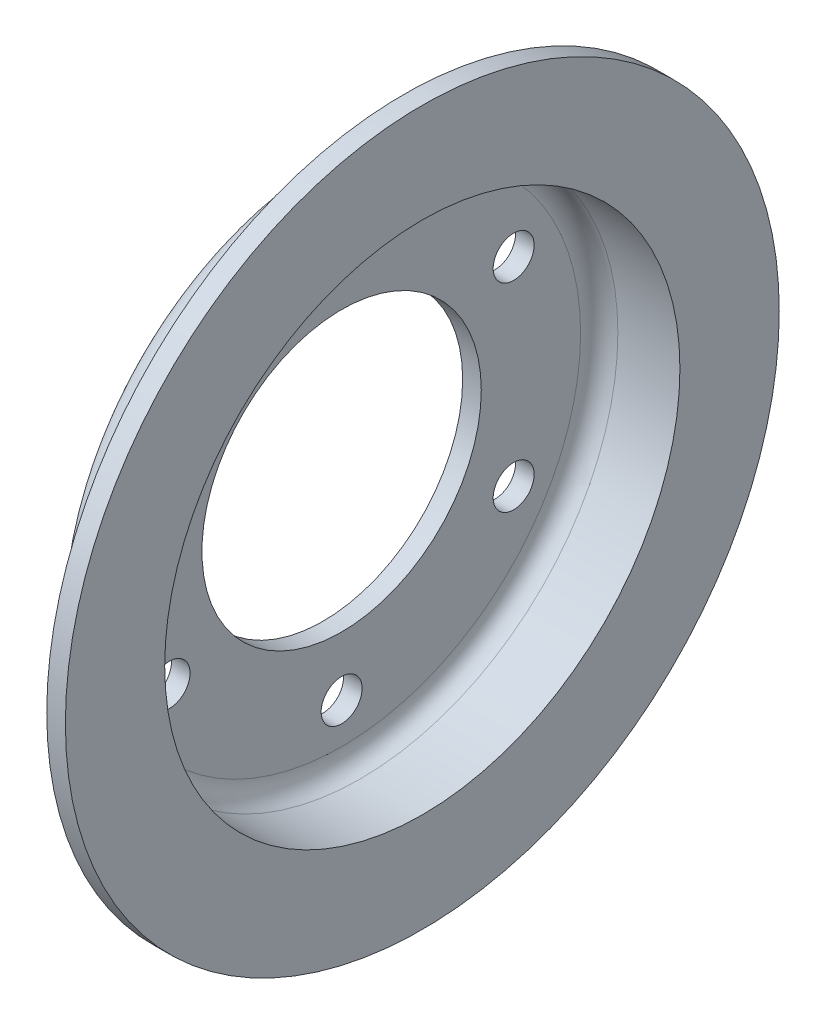
ISO-10303-21;
HEADER;
FILE_DESCRIPTION(('STEP AP214'),'2;1');
FILE_NAME('part.step','',(''),(''),'','','');
FILE_SCHEMA(('AUTOMOTIVE_DESIGN { 1 0 10303 214 1 1 1 1 }'));
ENDSEC;
DATA;
#1=APPLICATION_CONTEXT('core data for automotive mechanical design processes');
#2=APPLICATION_PROTOCOL_DEFINITION('international standard','automotive_design',2000,#1);
#3=PRODUCT_CONTEXT('',#1,'mechanical');
#4=PRODUCT('Part','Part','',(#3));
#5=PRODUCT_RELATED_PRODUCT_CATEGORY('part','',(#4));
#6=PRODUCT_DEFINITION_FORMATION('','',#4);
#7=PRODUCT_DEFINITION_CONTEXT('part definition',#1,'design');
#8=PRODUCT_DEFINITION('design','',#6,#7);
#9=PRODUCT_DEFINITION_SHAPE('','',#8);
#10=(LENGTH_UNIT() NAMED_UNIT(*) SI_UNIT(.MILLI.,.METRE.));
#11=(NAMED_UNIT(*) PLANE_ANGLE_UNIT() SI_UNIT($,.RADIAN.));
#12=(NAMED_UNIT(*) SI_UNIT($,.STERADIAN.) SOLID_ANGLE_UNIT());
#13=UNCERTAINTY_MEASURE_WITH_UNIT(LENGTH_MEASURE(1.E-05),#10,'distance_accuracy_value','');
#14=(GEOMETRIC_REPRESENTATION_CONTEXT(3) GLOBAL_UNCERTAINTY_ASSIGNED_CONTEXT((#13)) GLOBAL_UNIT_ASSIGNED_CONTEXT((#10,
#11,#12)) REPRESENTATION_CONTEXT('',''));
#15=CARTESIAN_POINT('',(0.,0.,0.));
#16=DIRECTION('',(0.,0.,1.));
#17=DIRECTION('',(1.,0.,0.));
#18=AXIS2_PLACEMENT_3D('',#15,#16,#17);
#19=CARTESIAN_POINT('',(13.,0.,0.));
#20=DIRECTION('',(-1.,0.,0.));
#21=DIRECTION('',(0.,0.,1.));
#22=AXIS2_PLACEMENT_3D('',#19,#20,#21);
#23=CYLINDRICAL_SURFACE('',#22,41.5);
#24=CARTESIAN_POINT('',(6.,0.,0.));
#25=DIRECTION('',(1.,0.,0.));
#26=DIRECTION('',(0.,0.,-1.));
#27=AXIS2_PLACEMENT_3D('',#24,#25,#26);
#28=CIRCLE('',#27,41.5);
#29=CARTESIAN_POINT('',(6.,0.,-41.5));
#30=VERTEX_POINT('',#29);
#31=EDGE_CURVE('E61',#30,#30,#28,.F.);
#32=ORIENTED_EDGE('',*,*,#31,.T.);
#33=EDGE_LOOP('',(#32));
#34=FACE_BOUND('',#33,.T.);
#35=CARTESIAN_POINT('',(16.,0.,0.));
#36=DIRECTION('',(1.,0.,0.));
#37=DIRECTION('',(0.,0.,-1.));
#38=AXIS2_PLACEMENT_3D('',#35,#36,#37);
#39=CIRCLE('',#38,41.5);
#40=CARTESIAN_POINT('',(16.,0.,-41.5));
#41=VERTEX_POINT('',#40);
#42=EDGE_CURVE('E76',#41,#41,#39,.T.);
#43=ORIENTED_EDGE('',*,*,#42,.T.);
#44=EDGE_LOOP('',(#43));
#45=FACE_BOUND('',#44,.T.);
#46=ADVANCED_FACE('F43',(#34,#45),#23,.F.);
#47=CARTESIAN_POINT('',(3.,0.,0.));
#48=DIRECTION('',(1.,0.,0.));
#49=DIRECTION('',(0.,0.,-1.));
#50=AXIS2_PLACEMENT_3D('',#47,#48,#49);
#51=PLANE('',#50);
#52=CARTESIAN_POINT('',(3.,16.0000000000003,-27.7128129211019));
#53=DIRECTION('',(1.,0.,0.));
#54=DIRECTION('',(0.,0.,-1.));
#55=AXIS2_PLACEMENT_3D('',#52,#53,#54);
#56=CIRCLE('',#55,3.29999999999999);
#57=CARTESIAN_POINT('',(3.,16.0000000000003,-31.0128129211018));
#58=VERTEX_POINT('',#57);
#59=EDGE_CURVE('E135',#58,#58,#56,.T.);
#60=ORIENTED_EDGE('',*,*,#59,.F.);
#61=EDGE_LOOP('',(#60));
#62=FACE_BOUND('',#61,.T.);
#63=CARTESIAN_POINT('',(3.,-15.9999999999997,-27.7128129211022));
#64=DIRECTION('',(1.,0.,0.));
#65=DIRECTION('',(0.,0.,-1.));
#66=AXIS2_PLACEMENT_3D('',#63,#64,#65);
#67=CIRCLE('',#66,3.29999999999999);
#68=CARTESIAN_POINT('',(3.,-15.9999999999997,-31.0128129211022));
#69=VERTEX_POINT('',#68);
#70=EDGE_CURVE('E127',#69,#69,#67,.T.);
#71=ORIENTED_EDGE('',*,*,#70,.F.);
#72=EDGE_LOOP('',(#71));
#73=FACE_BOUND('',#72,.T.);
#74=CARTESIAN_POINT('',(3.,-32.,0.));
#75=DIRECTION('',(1.,0.,0.));
#76=DIRECTION('',(0.,0.,-1.));
#77=AXIS2_PLACEMENT_3D('',#74,#75,#76);
#78=CIRCLE('',#77,3.29999999999999);
#79=CARTESIAN_POINT('',(3.,-32.,-3.29999999999999));
#80=VERTEX_POINT('',#79);
#81=EDGE_CURVE('E119',#80,#80,#78,.T.);
#82=ORIENTED_EDGE('',*,*,#81,.F.);
#83=EDGE_LOOP('',(#82));
#84=FACE_BOUND('',#83,.T.);
#85=CARTESIAN_POINT('',(3.,-16.0000000000001,27.712812921102));
#86=DIRECTION('',(1.,0.,0.));
#87=DIRECTION('',(0.,0.,-1.));
#88=AXIS2_PLACEMENT_3D('',#85,#86,#87);
#89=CIRCLE('',#88,3.29999999999999);
#90=CARTESIAN_POINT('',(3.,-16.0000000000001,24.412812921102));
#91=VERTEX_POINT('',#90);
#92=EDGE_CURVE('E111',#91,#91,#89,.T.);
#93=ORIENTED_EDGE('',*,*,#92,.F.);
#94=EDGE_LOOP('',(#93));
#95=FACE_BOUND('',#94,.T.);
#96=CARTESIAN_POINT('',(3.,15.9999999999999,27.7128129211021));
#97=DIRECTION('',(1.,0.,0.));
#98=DIRECTION('',(0.,0.,-1.));
#99=AXIS2_PLACEMENT_3D('',#96,#97,#98);
#100=CIRCLE('',#99,3.29999999999999);
#101=CARTESIAN_POINT('',(3.,15.9999999999999,24.4128129211021));
#102=VERTEX_POINT('',#101);
#103=EDGE_CURVE('E103',#102,#102,#100,.T.);
#104=ORIENTED_EDGE('',*,*,#103,.F.);
#105=EDGE_LOOP('',(#104));
#106=FACE_BOUND('',#105,.T.);
#107=CARTESIAN_POINT('',(3.,32.,0.));
#108=DIRECTION('',(1.,0.,0.));
#109=DIRECTION('',(0.,0.,-1.));
#110=AXIS2_PLACEMENT_3D('',#107,#108,#109);
#111=CIRCLE('',#110,3.29999999999998);
#112=CARTESIAN_POINT('',(3.,32.,-3.29999999999998));
#113=VERTEX_POINT('',#112);
#114=EDGE_CURVE('E95',#113,#113,#111,.T.);
#115=ORIENTED_EDGE('',*,*,#114,.F.);
#116=EDGE_LOOP('',(#115));
#117=FACE_BOUND('',#116,.T.);
#118=CARTESIAN_POINT('',(3.,0.,0.));
#119=DIRECTION('',(1.,0.,0.));
#120=DIRECTION('',(0.,0.,-1.));
#121=AXIS2_PLACEMENT_3D('',#118,#119,#120);
#122=CIRCLE('',#121,38.5);
#123=CARTESIAN_POINT('',(3.,0.,-38.5));
#124=VERTEX_POINT('',#123);
#125=EDGE_CURVE('E56',#124,#124,#122,.T.);
#126=ORIENTED_EDGE('',*,*,#125,.T.);
#127=EDGE_LOOP('',(#126));
#128=FACE_BOUND('',#127,.T.);
#129=CARTESIAN_POINT('',(3.,0.,0.));
#130=DIRECTION('',(1.,0.,0.));
#131=DIRECTION('',(0.,0.,-1.));
#132=AXIS2_PLACEMENT_3D('',#129,#130,#131);
#133=CIRCLE('',#132,22.5);
#134=CARTESIAN_POINT('',(3.,0.,-22.5));
#135=VERTEX_POINT('',#134);
#136=EDGE_CURVE('E84',#135,#135,#133,.T.);
#137=ORIENTED_EDGE('',*,*,#136,.F.);
#138=EDGE_LOOP('',(#137));
#139=FACE_BOUND('',#138,.T.);
#140=ADVANCED_FACE('F142',(#62,#73,#84,#95,#106,#117,#128,#139),#51,.T.);
#141=CARTESIAN_POINT('',(16.,0.,0.));
#142=DIRECTION('',(1.,0.,0.));
#143=DIRECTION('',(0.,0.,-1.));
#144=AXIS2_PLACEMENT_3D('',#141,#142,#143);
#145=PLANE('',#144);
#146=CARTESIAN_POINT('',(16.,0.,0.));
#147=DIRECTION('',(1.,0.,0.));
#148=DIRECTION('',(0.,0.,-1.));
#149=AXIS2_PLACEMENT_3D('',#146,#147,#148);
#150=CIRCLE('',#149,57.5);
#151=CARTESIAN_POINT('',(16.,0.,-57.5));
#152=VERTEX_POINT('',#151);
#153=EDGE_CURVE('E71',#152,#152,#150,.T.);
#154=ORIENTED_EDGE('',*,*,#153,.T.);
#155=EDGE_LOOP('',(#154));
#156=FACE_BOUND('',#155,.T.);
#157=ORIENTED_EDGE('',*,*,#42,.F.);
#158=EDGE_LOOP('',(#157));
#159=FACE_BOUND('',#158,.T.);
#160=ADVANCED_FACE('F145',(#156,#159),#145,.T.);
#161=CARTESIAN_POINT('',(13.,0.,0.));
#162=DIRECTION('',(1.,0.,0.));
#163=DIRECTION('',(0.,0.,-1.));
#164=AXIS2_PLACEMENT_3D('',#161,#162,#163);
#165=PLANE('',#164);
#166=CARTESIAN_POINT('',(13.,0.,0.));
#167=DIRECTION('',(1.,0.,0.));
#168=DIRECTION('',(0.,0.,-1.));
#169=AXIS2_PLACEMENT_3D('',#166,#167,#168);
#170=CIRCLE('',#169,44.5);
#171=CARTESIAN_POINT('',(13.,0.,-44.5));
#172=VERTEX_POINT('',#171);
#173=EDGE_CURVE('E67',#172,#172,#170,.T.);
#174=ORIENTED_EDGE('',*,*,#173,.T.);
#175=EDGE_LOOP('',(#174));
#176=FACE_BOUND('',#175,.T.);
#177=CARTESIAN_POINT('',(13.,0.,0.));
#178=DIRECTION('',(1.,0.,0.));
#179=DIRECTION('',(0.,0.,-1.));
#180=AXIS2_PLACEMENT_3D('',#177,#178,#179);
#181=CIRCLE('',#180,57.5);
#182=CARTESIAN_POINT('',(13.,0.,-57.5));
#183=VERTEX_POINT('',#182);
#184=EDGE_CURVE('E72',#183,#183,#181,.T.);
#185=ORIENTED_EDGE('',*,*,#184,.F.);
#186=EDGE_LOOP('',(#185));
#187=FACE_BOUND('',#186,.T.);
#188=ADVANCED_FACE('F192',(#176,#187),#165,.F.);
#189=CARTESIAN_POINT('',(16.,0.,0.));
#190=DIRECTION('',(-1.,0.,0.));
#191=DIRECTION('',(0.,0.,1.));
#192=AXIS2_PLACEMENT_3D('',#189,#190,#191);
#193=CYLINDRICAL_SURFACE('',#192,57.5);
#194=ORIENTED_EDGE('',*,*,#153,.F.);
#195=EDGE_LOOP('',(#194));
#196=FACE_BOUND('',#195,.T.);
#197=ORIENTED_EDGE('',*,*,#184,.T.);
#198=EDGE_LOOP('',(#197));
#199=FACE_BOUND('',#198,.T.);
#200=ADVANCED_FACE('F184',(#196,#199),#193,.T.);
#201=CARTESIAN_POINT('',(0.,0.,0.));
#202=DIRECTION('',(1.,0.,0.));
#203=DIRECTION('',(0.,0.,-1.));
#204=AXIS2_PLACEMENT_3D('',#201,#202,#203);
#205=PLANE('',#204);
#206=CARTESIAN_POINT('',(0.,16.0000000000003,-27.7128129211019));
#207=DIRECTION('',(1.,0.,0.));
#208=DIRECTION('',(0.,0.,-1.));
#209=AXIS2_PLACEMENT_3D('',#206,#207,#208);
#210=CIRCLE('',#209,3.3);
#211=CARTESIAN_POINT('',(0.,16.0000000000003,-31.0128129211018));
#212=VERTEX_POINT('',#211);
#213=EDGE_CURVE('E131',#212,#212,#210,.T.);
#214=ORIENTED_EDGE('',*,*,#213,.T.);
#215=EDGE_LOOP('',(#214));
#216=FACE_BOUND('',#215,.T.);
#217=CARTESIAN_POINT('',(0.,-15.9999999999997,-27.7128129211022));
#218=DIRECTION('',(1.,0.,0.));
#219=DIRECTION('',(0.,0.,-1.));
#220=AXIS2_PLACEMENT_3D('',#217,#218,#219);
#221=CIRCLE('',#220,3.3);
#222=CARTESIAN_POINT('',(0.,-15.9999999999997,-31.0128129211022));
#223=VERTEX_POINT('',#222);
#224=EDGE_CURVE('E123',#223,#223,#221,.T.);
#225=ORIENTED_EDGE('',*,*,#224,.T.);
#226=EDGE_LOOP('',(#225));
#227=FACE_BOUND('',#226,.T.);
#228=CARTESIAN_POINT('',(0.,-32.,0.));
#229=DIRECTION('',(1.,0.,0.));
#230=DIRECTION('',(0.,0.,-1.));
#231=AXIS2_PLACEMENT_3D('',#228,#229,#230);
#232=CIRCLE('',#231,3.3);
#233=CARTESIAN_POINT('',(0.,-32.,-3.3));
#234=VERTEX_POINT('',#233);
#235=EDGE_CURVE('E115',#234,#234,#232,.T.);
#236=ORIENTED_EDGE('',*,*,#235,.T.);
#237=EDGE_LOOP('',(#236));
#238=FACE_BOUND('',#237,.T.);
#239=CARTESIAN_POINT('',(0.,-16.0000000000001,27.712812921102));
#240=DIRECTION('',(1.,0.,0.));
#241=DIRECTION('',(0.,0.,-1.));
#242=AXIS2_PLACEMENT_3D('',#239,#240,#241);
#243=CIRCLE('',#242,3.3);
#244=CARTESIAN_POINT('',(0.,-16.0000000000001,24.412812921102));
#245=VERTEX_POINT('',#244);
#246=EDGE_CURVE('E107',#245,#245,#243,.T.);
#247=ORIENTED_EDGE('',*,*,#246,.T.);
#248=EDGE_LOOP('',(#247));
#249=FACE_BOUND('',#248,.T.);
#250=CARTESIAN_POINT('',(0.,15.9999999999999,27.7128129211021));
#251=DIRECTION('',(1.,0.,0.));
#252=DIRECTION('',(0.,0.,-1.));
#253=AXIS2_PLACEMENT_3D('',#250,#251,#252);
#254=CIRCLE('',#253,3.3);
#255=CARTESIAN_POINT('',(0.,15.9999999999999,24.4128129211021));
#256=VERTEX_POINT('',#255);
#257=EDGE_CURVE('E99',#256,#256,#254,.T.);
#258=ORIENTED_EDGE('',*,*,#257,.T.);
#259=EDGE_LOOP('',(#258));
#260=FACE_BOUND('',#259,.T.);
#261=CARTESIAN_POINT('',(0.,32.,0.));
#262=DIRECTION('',(1.,0.,0.));
#263=DIRECTION('',(0.,0.,-1.));
#264=AXIS2_PLACEMENT_3D('',#261,#262,#263);
#265=CIRCLE('',#264,3.3);
#266=CARTESIAN_POINT('',(0.,32.,-3.3));
#267=VERTEX_POINT('',#266);
#268=EDGE_CURVE('E88',#267,#267,#265,.T.);
#269=ORIENTED_EDGE('',*,*,#268,.T.);
#270=EDGE_LOOP('',(#269));
#271=FACE_BOUND('',#270,.T.);
#272=CARTESIAN_POINT('',(0.,0.,0.));
#273=DIRECTION('',(1.,0.,0.));
#274=DIRECTION('',(0.,0.,-1.));
#275=AXIS2_PLACEMENT_3D('',#272,#273,#274);
#276=CIRCLE('',#275,39.5);
#277=CARTESIAN_POINT('',(0.,0.,-39.5));
#278=VERTEX_POINT('',#277);
#279=EDGE_CURVE('E10',#278,#278,#276,.F.);
#280=ORIENTED_EDGE('',*,*,#279,.T.);
#281=EDGE_LOOP('',(#280));
#282=FACE_BOUND('',#281,.T.);
#283=CARTESIAN_POINT('',(0.,0.,0.));
#284=DIRECTION('',(1.,0.,0.));
#285=DIRECTION('',(0.,0.,-1.));
#286=AXIS2_PLACEMENT_3D('',#283,#284,#285);
#287=CIRCLE('',#286,22.5);
#288=CARTESIAN_POINT('',(0.,0.,-22.5));
#289=VERTEX_POINT('',#288);
#290=EDGE_CURVE('E83',#289,#289,#287,.T.);
#291=ORIENTED_EDGE('',*,*,#290,.T.);
#292=EDGE_LOOP('',(#291));
#293=FACE_BOUND('',#292,.T.);
#294=ADVANCED_FACE('F172',(#216,#227,#238,#249,#260,#271,#282,#293),#205,.F.);
#295=CARTESIAN_POINT('',(3.,0.,0.));
#296=DIRECTION('',(-1.,0.,0.));
#297=DIRECTION('',(0.,0.,1.));
#298=AXIS2_PLACEMENT_3D('',#295,#296,#297);
#299=CYLINDRICAL_SURFACE('',#298,44.5);
#300=CARTESIAN_POINT('',(5.,0.,0.));
#301=DIRECTION('',(1.,0.,0.));
#302=DIRECTION('',(0.,0.,-1.));
#303=AXIS2_PLACEMENT_3D('',#300,#301,#302);
#304=CIRCLE('',#303,44.5);
#305=CARTESIAN_POINT('',(5.,0.,-44.5));
#306=VERTEX_POINT('',#305);
#307=EDGE_CURVE('E51',#306,#306,#304,.T.);
#308=ORIENTED_EDGE('',*,*,#307,.T.);
#309=EDGE_LOOP('',(#308));
#310=FACE_BOUND('',#309,.T.);
#311=ORIENTED_EDGE('',*,*,#173,.F.);
#312=EDGE_LOOP('',(#311));
#313=FACE_BOUND('',#312,.T.);
#314=ADVANCED_FACE('F164',(#310,#313),#299,.T.);
#315=CARTESIAN_POINT('',(0.,0.,0.));
#316=DIRECTION('',(1.,0.,0.));
#317=DIRECTION('',(0.,0.,-1.));
#318=AXIS2_PLACEMENT_3D('',#315,#316,#317);
#319=CYLINDRICAL_SURFACE('',#318,22.5);
#320=ORIENTED_EDGE('',*,*,#290,.F.);
#321=EDGE_LOOP('',(#320));
#322=FACE_BOUND('',#321,.T.);
#323=ORIENTED_EDGE('',*,*,#136,.T.);
#324=EDGE_LOOP('',(#323));
#325=FACE_BOUND('',#324,.T.);
#326=ADVANCED_FACE('F161',(#322,#325),#319,.F.);
#327=CARTESIAN_POINT('',(6.,0.,0.));
#328=DIRECTION('',(1.,0.,0.));
#329=DIRECTION('',(0.,0.,-1.));
#330=AXIS2_PLACEMENT_3D('',#327,#328,#329);
#331=TOROIDAL_SURFACE('',#330,38.5,3.);
#332=ORIENTED_EDGE('',*,*,#125,.F.);
#333=EDGE_LOOP('',(#332));
#334=FACE_BOUND('',#333,.T.);
#335=ORIENTED_EDGE('',*,*,#31,.F.);
#336=EDGE_LOOP('',(#335));
#337=FACE_BOUND('',#336,.T.);
#338=ADVANCED_FACE('F163',(#334,#337),#331,.F.);
#339=CARTESIAN_POINT('',(5.,0.,0.));
#340=DIRECTION('',(1.,0.,0.));
#341=DIRECTION('',(0.,0.,-1.));
#342=AXIS2_PLACEMENT_3D('',#339,#340,#341);
#343=TOROIDAL_SURFACE('',#342,39.5,5.);
#344=ORIENTED_EDGE('',*,*,#279,.F.);
#345=EDGE_LOOP('',(#344));
#346=FACE_BOUND('',#345,.T.);
#347=ORIENTED_EDGE('',*,*,#307,.F.);
#348=EDGE_LOOP('',(#347));
#349=FACE_BOUND('',#348,.T.);
#350=ADVANCED_FACE('F45',(#346,#349),#343,.T.);
#351=CARTESIAN_POINT('',(3.,32.,0.));
#352=DIRECTION('',(1.,0.,0.));
#353=DIRECTION('',(0.,0.,-1.));
#354=AXIS2_PLACEMENT_3D('',#351,#352,#353);
#355=CYLINDRICAL_SURFACE('',#354,3.29999999999999);
#356=ORIENTED_EDGE('',*,*,#268,.F.);
#357=EDGE_LOOP('',(#356));
#358=FACE_BOUND('',#357,.T.);
#359=ORIENTED_EDGE('',*,*,#114,.T.);
#360=EDGE_LOOP('',(#359));
#361=FACE_BOUND('',#360,.T.);
#362=ADVANCED_FACE('F207',(#358,#361),#355,.F.);
#363=CARTESIAN_POINT('',(3.,15.9999999999999,27.7128129211021));
#364=DIRECTION('',(1.,0.,0.));
#365=DIRECTION('',(0.,0.,-1.));
#366=AXIS2_PLACEMENT_3D('',#363,#364,#365);
#367=CYLINDRICAL_SURFACE('',#366,3.29999999999999);
#368=ORIENTED_EDGE('',*,*,#257,.F.);
#369=EDGE_LOOP('',(#368));
#370=FACE_BOUND('',#369,.T.);
#371=ORIENTED_EDGE('',*,*,#103,.T.);
#372=EDGE_LOOP('',(#371));
#373=FACE_BOUND('',#372,.T.);
#374=ADVANCED_FACE('F210',(#370,#373),#367,.F.);
#375=CARTESIAN_POINT('',(3.,-16.0000000000001,27.712812921102));
#376=DIRECTION('',(1.,0.,0.));
#377=DIRECTION('',(0.,0.,-1.));
#378=AXIS2_PLACEMENT_3D('',#375,#376,#377);
#379=CYLINDRICAL_SURFACE('',#378,3.29999999999999);
#380=ORIENTED_EDGE('',*,*,#246,.F.);
#381=EDGE_LOOP('',(#380));
#382=FACE_BOUND('',#381,.T.);
#383=ORIENTED_EDGE('',*,*,#92,.T.);
#384=EDGE_LOOP('',(#383));
#385=FACE_BOUND('',#384,.T.);
#386=ADVANCED_FACE('F215',(#382,#385),#379,.F.);
#387=CARTESIAN_POINT('',(3.,-32.,0.));
#388=DIRECTION('',(1.,0.,0.));
#389=DIRECTION('',(0.,0.,-1.));
#390=AXIS2_PLACEMENT_3D('',#387,#388,#389);
#391=CYLINDRICAL_SURFACE('',#390,3.29999999999999);
#392=ORIENTED_EDGE('',*,*,#235,.F.);
#393=EDGE_LOOP('',(#392));
#394=FACE_BOUND('',#393,.T.);
#395=ORIENTED_EDGE('',*,*,#81,.T.);
#396=EDGE_LOOP('',(#395));
#397=FACE_BOUND('',#396,.T.);
#398=ADVANCED_FACE('F222',(#394,#397),#391,.F.);
#399=CARTESIAN_POINT('',(3.,-15.9999999999997,-27.7128129211022));
#400=DIRECTION('',(1.,0.,0.));
#401=DIRECTION('',(0.,0.,-1.));
#402=AXIS2_PLACEMENT_3D('',#399,#400,#401);
#403=CYLINDRICAL_SURFACE('',#402,3.29999999999999);
#404=ORIENTED_EDGE('',*,*,#224,.F.);
#405=EDGE_LOOP('',(#404));
#406=FACE_BOUND('',#405,.T.);
#407=ORIENTED_EDGE('',*,*,#70,.T.);
#408=EDGE_LOOP('',(#407));
#409=FACE_BOUND('',#408,.T.);
#410=ADVANCED_FACE('F226',(#406,#409),#403,.F.);
#411=CARTESIAN_POINT('',(3.,16.0000000000003,-27.7128129211019));
#412=DIRECTION('',(1.,0.,0.));
#413=DIRECTION('',(0.,0.,-1.));
#414=AXIS2_PLACEMENT_3D('',#411,#412,#413);
#415=CYLINDRICAL_SURFACE('',#414,3.29999999999999);
#416=ORIENTED_EDGE('',*,*,#213,.F.);
#417=EDGE_LOOP('',(#416));
#418=FACE_BOUND('',#417,.T.);
#419=ORIENTED_EDGE('',*,*,#59,.T.);
#420=EDGE_LOOP('',(#419));
#421=FACE_BOUND('',#420,.T.);
#422=ADVANCED_FACE('F140',(#418,#421),#415,.F.);
#423=CLOSED_SHELL('',(#46,#140,#160,#188,#200,#294,#314,#326,#338,#350,#362,#374,#386,#398,#410,#422));
#424=MANIFOLD_SOLID_BREP('B2',#423);
#425=ADVANCED_BREP_SHAPE_REPRESENTATION('',(#18,#424),#14);
#426=SHAPE_DEFINITION_REPRESENTATION(#9,#425);
ENDSEC;
END-ISO-10303-21;
